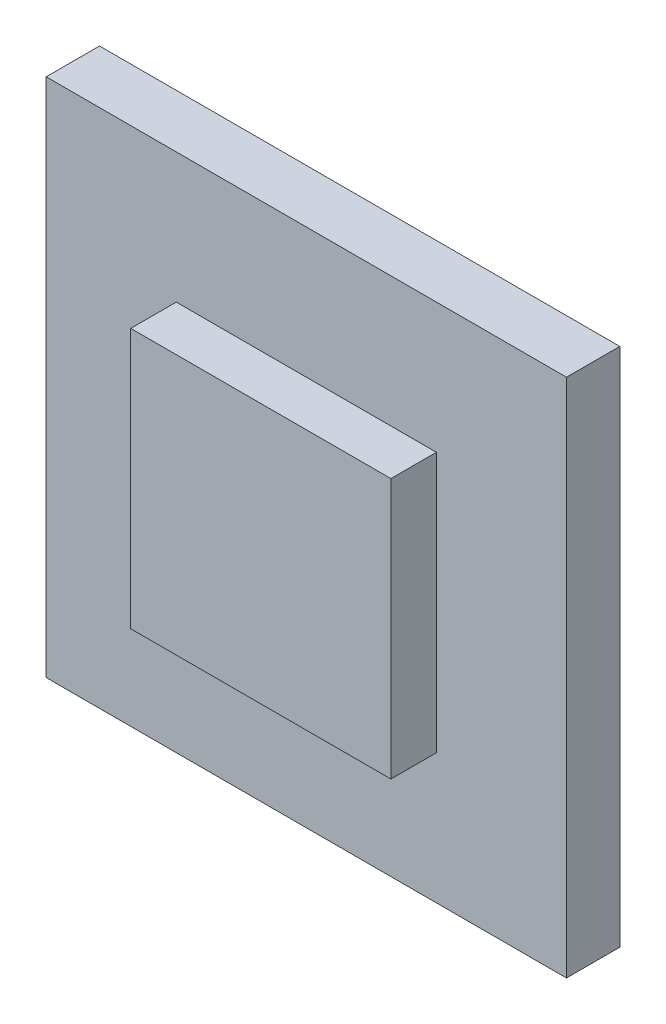
ISO-10303-21;
HEADER;
FILE_DESCRIPTION(('STEP AP214'),'2;1');
FILE_NAME('part.step','',(''),(''),'','','');
FILE_SCHEMA(('AUTOMOTIVE_DESIGN { 1 0 10303 214 1 1 1 1 }'));
ENDSEC;
DATA;
#1=APPLICATION_CONTEXT('core data for automotive mechanical design processes');
#2=APPLICATION_PROTOCOL_DEFINITION('international standard','automotive_design',2000,#1);
#3=PRODUCT_CONTEXT('',#1,'mechanical');
#4=PRODUCT('Part','Part','',(#3));
#5=PRODUCT_RELATED_PRODUCT_CATEGORY('part','',(#4));
#6=PRODUCT_DEFINITION_FORMATION('','',#4);
#7=PRODUCT_DEFINITION_CONTEXT('part definition',#1,'design');
#8=PRODUCT_DEFINITION('design','',#6,#7);
#9=PRODUCT_DEFINITION_SHAPE('','',#8);
#10=(LENGTH_UNIT() NAMED_UNIT(*) SI_UNIT(.MILLI.,.METRE.));
#11=(NAMED_UNIT(*) PLANE_ANGLE_UNIT() SI_UNIT($,.RADIAN.));
#12=(NAMED_UNIT(*) SI_UNIT($,.STERADIAN.) SOLID_ANGLE_UNIT());
#13=UNCERTAINTY_MEASURE_WITH_UNIT(LENGTH_MEASURE(1.E-05),#10,'distance_accuracy_value','');
#14=(GEOMETRIC_REPRESENTATION_CONTEXT(3) GLOBAL_UNCERTAINTY_ASSIGNED_CONTEXT((#13)) GLOBAL_UNIT_ASSIGNED_CONTEXT((#10,
#11,#12)) REPRESENTATION_CONTEXT('',''));
#15=CARTESIAN_POINT('',(0.,0.,0.));
#16=DIRECTION('',(0.,0.,1.));
#17=DIRECTION('',(1.,0.,0.));
#18=AXIS2_PLACEMENT_3D('',#15,#16,#17);
#19=CARTESIAN_POINT('',(-2.,-2.,0.41));
#20=DIRECTION('',(1.,0.,0.));
#21=DIRECTION('',(0.,0.,-1.));
#22=AXIS2_PLACEMENT_3D('',#19,#20,#21);
#23=PLANE('',#22);
#24=DIRECTION('',(0.,-1.,0.));
#25=VECTOR('',#24,1.);
#26=CARTESIAN_POINT('',(-2.,-2.,0.));
#27=LINE('',#26,#25);
#28=CARTESIAN_POINT('',(-2.,2.,0.));
#29=VERTEX_POINT('',#28);
#30=CARTESIAN_POINT('',(-2.,-2.,0.));
#31=VERTEX_POINT('',#30);
#32=EDGE_CURVE('E118',#29,#31,#27,.T.);
#33=ORIENTED_EDGE('',*,*,#32,.T.);
#34=DIRECTION('',(0.,0.,-1.));
#35=VECTOR('',#34,1.);
#36=CARTESIAN_POINT('',(-2.,-2.,0.41));
#37=LINE('',#36,#35);
#38=CARTESIAN_POINT('',(-2.,-2.,0.41));
#39=VERTEX_POINT('',#38);
#40=EDGE_CURVE('E11',#39,#31,#37,.T.);
#41=ORIENTED_EDGE('',*,*,#40,.F.);
#42=DIRECTION('',(0.,-1.,0.));
#43=VECTOR('',#42,1.);
#44=CARTESIAN_POINT('',(-2.,-2.,0.41));
#45=LINE('',#44,#43);
#46=CARTESIAN_POINT('',(-2.,2.,0.41));
#47=VERTEX_POINT('',#46);
#48=EDGE_CURVE('E127',#47,#39,#45,.T.);
#49=ORIENTED_EDGE('',*,*,#48,.F.);
#50=DIRECTION('',(0.,0.,-1.));
#51=VECTOR('',#50,1.);
#52=CARTESIAN_POINT('',(-2.,2.,0.41));
#53=LINE('',#52,#51);
#54=EDGE_CURVE('E136',#47,#29,#53,.T.);
#55=ORIENTED_EDGE('',*,*,#54,.T.);
#56=EDGE_LOOP('',(#33,#41,#49,#55));
#57=FACE_BOUND('',#56,.T.);
#58=ADVANCED_FACE('F34',(#57),#23,.F.);
#59=CARTESIAN_POINT('',(2.,-2.,0.41));
#60=DIRECTION('',(0.,1.,0.));
#61=DIRECTION('',(0.,0.,1.));
#62=AXIS2_PLACEMENT_3D('',#59,#60,#61);
#63=PLANE('',#62);
#64=DIRECTION('',(1.,0.,0.));
#65=VECTOR('',#64,1.);
#66=CARTESIAN_POINT('',(2.,-2.,0.));
#67=LINE('',#66,#65);
#68=CARTESIAN_POINT('',(2.,-2.,0.));
#69=VERTEX_POINT('',#68);
#70=EDGE_CURVE('E121',#31,#69,#67,.T.);
#71=ORIENTED_EDGE('',*,*,#70,.T.);
#72=DIRECTION('',(0.,0.,-1.));
#73=VECTOR('',#72,1.);
#74=CARTESIAN_POINT('',(2.,-2.,0.41));
#75=LINE('',#74,#73);
#76=CARTESIAN_POINT('',(2.,-2.,0.41));
#77=VERTEX_POINT('',#76);
#78=EDGE_CURVE('E41',#77,#69,#75,.T.);
#79=ORIENTED_EDGE('',*,*,#78,.F.);
#80=DIRECTION('',(1.,0.,0.));
#81=VECTOR('',#80,1.);
#82=CARTESIAN_POINT('',(2.,-2.,0.41));
#83=LINE('',#82,#81);
#84=EDGE_CURVE('E130',#39,#77,#83,.T.);
#85=ORIENTED_EDGE('',*,*,#84,.F.);
#86=ORIENTED_EDGE('',*,*,#40,.T.);
#87=EDGE_LOOP('',(#71,#79,#85,#86));
#88=FACE_BOUND('',#87,.T.);
#89=ADVANCED_FACE('F167',(#88),#63,.F.);
#90=CARTESIAN_POINT('',(2.,-2.,0.41));
#91=DIRECTION('',(-1.,0.,0.));
#92=DIRECTION('',(0.,0.,1.));
#93=AXIS2_PLACEMENT_3D('',#90,#91,#92);
#94=PLANE('',#93);
#95=DIRECTION('',(0.,1.,0.));
#96=VECTOR('',#95,1.);
#97=CARTESIAN_POINT('',(2.,-2.,0.));
#98=LINE('',#97,#96);
#99=CARTESIAN_POINT('',(2.,2.,0.));
#100=VERTEX_POINT('',#99);
#101=EDGE_CURVE('E139',#69,#100,#98,.T.);
#102=ORIENTED_EDGE('',*,*,#101,.T.);
#103=DIRECTION('',(0.,0.,-1.));
#104=VECTOR('',#103,1.);
#105=CARTESIAN_POINT('',(2.,2.,0.41));
#106=LINE('',#105,#104);
#107=CARTESIAN_POINT('',(2.,2.,0.41));
#108=VERTEX_POINT('',#107);
#109=EDGE_CURVE('E144',#108,#100,#106,.T.);
#110=ORIENTED_EDGE('',*,*,#109,.F.);
#111=DIRECTION('',(0.,1.,0.));
#112=VECTOR('',#111,1.);
#113=CARTESIAN_POINT('',(2.,-2.,0.41));
#114=LINE('',#113,#112);
#115=EDGE_CURVE('E133',#77,#108,#114,.T.);
#116=ORIENTED_EDGE('',*,*,#115,.F.);
#117=ORIENTED_EDGE('',*,*,#78,.T.);
#118=EDGE_LOOP('',(#102,#110,#116,#117));
#119=FACE_BOUND('',#118,.T.);
#120=ADVANCED_FACE('F151',(#119),#94,.F.);
#121=CARTESIAN_POINT('',(2.,2.,0.41));
#122=DIRECTION('',(0.,-1.,0.));
#123=DIRECTION('',(0.,0.,-1.));
#124=AXIS2_PLACEMENT_3D('',#121,#122,#123);
#125=PLANE('',#124);
#126=DIRECTION('',(-1.,0.,0.));
#127=VECTOR('',#126,1.);
#128=CARTESIAN_POINT('',(2.,2.,0.));
#129=LINE('',#128,#127);
#130=EDGE_CURVE('E131',#100,#29,#129,.T.);
#131=ORIENTED_EDGE('',*,*,#130,.T.);
#132=ORIENTED_EDGE('',*,*,#54,.F.);
#133=DIRECTION('',(-1.,0.,0.));
#134=VECTOR('',#133,1.);
#135=CARTESIAN_POINT('',(2.,2.,0.41));
#136=LINE('',#135,#134);
#137=EDGE_CURVE('E135',#108,#47,#136,.T.);
#138=ORIENTED_EDGE('',*,*,#137,.F.);
#139=ORIENTED_EDGE('',*,*,#109,.T.);
#140=EDGE_LOOP('',(#131,#132,#138,#139));
#141=FACE_BOUND('',#140,.T.);
#142=ADVANCED_FACE('F160',(#141),#125,.F.);
#143=CARTESIAN_POINT('',(0.,0.,0.41));
#144=DIRECTION('',(0.,0.,1.));
#145=DIRECTION('',(1.,0.,0.));
#146=AXIS2_PLACEMENT_3D('',#143,#144,#145);
#147=PLANE('',#146);
#148=DIRECTION('',(0.,-1.,0.));
#149=VECTOR('',#148,1.);
#150=CARTESIAN_POINT('',(-1.,-1.,0.41));
#151=LINE('',#150,#149);
#152=CARTESIAN_POINT('',(-1.,1.,0.41));
#153=VERTEX_POINT('',#152);
#154=CARTESIAN_POINT('',(-1.,-1.,0.41));
#155=VERTEX_POINT('',#154);
#156=EDGE_CURVE('E48',#153,#155,#151,.T.);
#157=ORIENTED_EDGE('',*,*,#156,.F.);
#158=DIRECTION('',(-1.,0.,0.));
#159=VECTOR('',#158,1.);
#160=CARTESIAN_POINT('',(1.,1.,0.41));
#161=LINE('',#160,#159);
#162=CARTESIAN_POINT('',(1.,1.,0.41));
#163=VERTEX_POINT('',#162);
#164=EDGE_CURVE('E52',#163,#153,#161,.T.);
#165=ORIENTED_EDGE('',*,*,#164,.F.);
#166=DIRECTION('',(0.,1.,0.));
#167=VECTOR('',#166,1.);
#168=CARTESIAN_POINT('',(1.,-1.,0.41));
#169=LINE('',#168,#167);
#170=CARTESIAN_POINT('',(1.,-1.,0.41));
#171=VERTEX_POINT('',#170);
#172=EDGE_CURVE('E261',#171,#163,#169,.T.);
#173=ORIENTED_EDGE('',*,*,#172,.F.);
#174=DIRECTION('',(1.,0.,0.));
#175=VECTOR('',#174,1.);
#176=CARTESIAN_POINT('',(1.,-1.,0.41));
#177=LINE('',#176,#175);
#178=EDGE_CURVE('E267',#155,#171,#177,.T.);
#179=ORIENTED_EDGE('',*,*,#178,.F.);
#180=EDGE_LOOP('',(#157,#165,#173,#179));
#181=FACE_BOUND('',#180,.T.);
#182=ORIENTED_EDGE('',*,*,#48,.T.);
#183=ORIENTED_EDGE('',*,*,#84,.T.);
#184=ORIENTED_EDGE('',*,*,#115,.T.);
#185=ORIENTED_EDGE('',*,*,#137,.T.);
#186=EDGE_LOOP('',(#182,#183,#184,#185));
#187=FACE_BOUND('',#186,.T.);
#188=ADVANCED_FACE('F166',(#181,#187),#147,.T.);
#189=CARTESIAN_POINT('',(0.,0.,0.));
#190=DIRECTION('',(0.,0.,1.));
#191=DIRECTION('',(1.,0.,0.));
#192=AXIS2_PLACEMENT_3D('',#189,#190,#191);
#193=PLANE('',#192);
#194=ORIENTED_EDGE('',*,*,#32,.F.);
#195=ORIENTED_EDGE('',*,*,#130,.F.);
#196=ORIENTED_EDGE('',*,*,#101,.F.);
#197=ORIENTED_EDGE('',*,*,#70,.F.);
#198=EDGE_LOOP('',(#194,#195,#196,#197));
#199=FACE_BOUND('',#198,.T.);
#200=ADVANCED_FACE('F157',(#199),#193,.F.);
#201=CARTESIAN_POINT('',(-1.,-1.,0.76));
#202=DIRECTION('',(1.,0.,0.));
#203=DIRECTION('',(0.,0.,-1.));
#204=AXIS2_PLACEMENT_3D('',#201,#202,#203);
#205=PLANE('',#204);
#206=ORIENTED_EDGE('',*,*,#156,.T.);
#207=DIRECTION('',(0.,0.,-1.));
#208=VECTOR('',#207,1.);
#209=CARTESIAN_POINT('',(-1.,-1.,0.76));
#210=LINE('',#209,#208);
#211=CARTESIAN_POINT('',(-1.,-1.,0.76));
#212=VERTEX_POINT('',#211);
#213=EDGE_CURVE('E101',#212,#155,#210,.T.);
#214=ORIENTED_EDGE('',*,*,#213,.F.);
#215=DIRECTION('',(0.,-1.,0.));
#216=VECTOR('',#215,1.);
#217=CARTESIAN_POINT('',(-1.,-1.,0.76));
#218=LINE('',#217,#216);
#219=CARTESIAN_POINT('',(-1.,1.,0.76));
#220=VERTEX_POINT('',#219);
#221=EDGE_CURVE('E107',#220,#212,#218,.T.);
#222=ORIENTED_EDGE('',*,*,#221,.F.);
#223=DIRECTION('',(0.,0.,-1.));
#224=VECTOR('',#223,1.);
#225=CARTESIAN_POINT('',(-1.,1.,0.76));
#226=LINE('',#225,#224);
#227=EDGE_CURVE('E259',#220,#153,#226,.T.);
#228=ORIENTED_EDGE('',*,*,#227,.T.);
#229=EDGE_LOOP('',(#206,#214,#222,#228));
#230=FACE_BOUND('',#229,.T.);
#231=ADVANCED_FACE('F117',(#230),#205,.F.);
#232=CARTESIAN_POINT('',(1.,-1.,0.76));
#233=DIRECTION('',(0.,1.,0.));
#234=DIRECTION('',(-1.,0.,0.));
#235=AXIS2_PLACEMENT_3D('',#232,#233,#234);
#236=PLANE('',#235);
#237=ORIENTED_EDGE('',*,*,#178,.T.);
#238=DIRECTION('',(0.,0.,-1.));
#239=VECTOR('',#238,1.);
#240=CARTESIAN_POINT('',(1.,-1.,0.76));
#241=LINE('',#240,#239);
#242=CARTESIAN_POINT('',(1.,-1.,0.76));
#243=VERTEX_POINT('',#242);
#244=EDGE_CURVE('E103',#243,#171,#241,.T.);
#245=ORIENTED_EDGE('',*,*,#244,.F.);
#246=DIRECTION('',(1.,0.,0.));
#247=VECTOR('',#246,1.);
#248=CARTESIAN_POINT('',(1.,-1.,0.76));
#249=LINE('',#248,#247);
#250=EDGE_CURVE('E96',#212,#243,#249,.T.);
#251=ORIENTED_EDGE('',*,*,#250,.F.);
#252=ORIENTED_EDGE('',*,*,#213,.T.);
#253=EDGE_LOOP('',(#237,#245,#251,#252));
#254=FACE_BOUND('',#253,.T.);
#255=ADVANCED_FACE('F99',(#254),#236,.F.);
#256=CARTESIAN_POINT('',(1.,-1.,0.76));
#257=DIRECTION('',(-1.,0.,0.));
#258=DIRECTION('',(0.,0.,1.));
#259=AXIS2_PLACEMENT_3D('',#256,#257,#258);
#260=PLANE('',#259);
#261=ORIENTED_EDGE('',*,*,#172,.T.);
#262=DIRECTION('',(0.,0.,-1.));
#263=VECTOR('',#262,1.);
#264=CARTESIAN_POINT('',(1.,1.,0.76));
#265=LINE('',#264,#263);
#266=CARTESIAN_POINT('',(1.,1.,0.76));
#267=VERTEX_POINT('',#266);
#268=EDGE_CURVE('E123',#267,#163,#265,.T.);
#269=ORIENTED_EDGE('',*,*,#268,.F.);
#270=DIRECTION('',(0.,1.,0.));
#271=VECTOR('',#270,1.);
#272=CARTESIAN_POINT('',(1.,-1.,0.76));
#273=LINE('',#272,#271);
#274=EDGE_CURVE('E106',#243,#267,#273,.T.);
#275=ORIENTED_EDGE('',*,*,#274,.F.);
#276=ORIENTED_EDGE('',*,*,#244,.T.);
#277=EDGE_LOOP('',(#261,#269,#275,#276));
#278=FACE_BOUND('',#277,.T.);
#279=ADVANCED_FACE('F185',(#278),#260,.F.);
#280=CARTESIAN_POINT('',(1.,1.,0.76));
#281=DIRECTION('',(0.,-1.,0.));
#282=DIRECTION('',(1.,0.,0.));
#283=AXIS2_PLACEMENT_3D('',#280,#281,#282);
#284=PLANE('',#283);
#285=ORIENTED_EDGE('',*,*,#164,.T.);
#286=ORIENTED_EDGE('',*,*,#227,.F.);
#287=DIRECTION('',(-1.,0.,0.));
#288=VECTOR('',#287,1.);
#289=CARTESIAN_POINT('',(1.,1.,0.76));
#290=LINE('',#289,#288);
#291=EDGE_CURVE('E112',#267,#220,#290,.T.);
#292=ORIENTED_EDGE('',*,*,#291,.F.);
#293=ORIENTED_EDGE('',*,*,#268,.T.);
#294=EDGE_LOOP('',(#285,#286,#292,#293));
#295=FACE_BOUND('',#294,.T.);
#296=ADVANCED_FACE('F188',(#295),#284,.F.);
#297=CARTESIAN_POINT('',(0.,0.,0.76));
#298=DIRECTION('',(0.,0.,1.));
#299=DIRECTION('',(1.,0.,0.));
#300=AXIS2_PLACEMENT_3D('',#297,#298,#299);
#301=PLANE('',#300);
#302=ORIENTED_EDGE('',*,*,#221,.T.);
#303=ORIENTED_EDGE('',*,*,#250,.T.);
#304=ORIENTED_EDGE('',*,*,#274,.T.);
#305=ORIENTED_EDGE('',*,*,#291,.T.);
#306=EDGE_LOOP('',(#302,#303,#304,#305));
#307=FACE_BOUND('',#306,.T.);
#308=ADVANCED_FACE('F110',(#307),#301,.T.);
#309=CLOSED_SHELL('',(#58,#89,#120,#142,#188,#200,#231,#255,#279,#296,#308));
#310=MANIFOLD_SOLID_BREP('B2',#309);
#311=ADVANCED_BREP_SHAPE_REPRESENTATION('',(#18,#310),#14);
#312=SHAPE_DEFINITION_REPRESENTATION(#9,#311);
ENDSEC;
END-ISO-10303-21;
